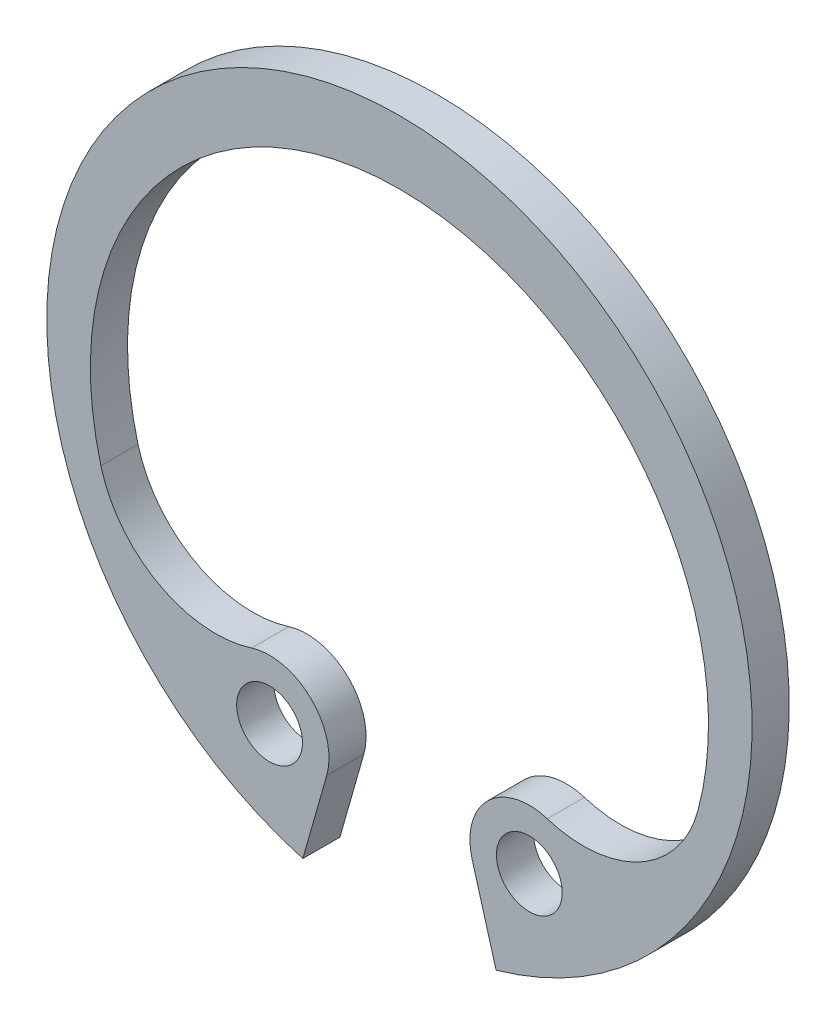
ISO-10303-21;
HEADER;
FILE_DESCRIPTION(('STEP AP214'),'2;1');
FILE_NAME('part.step','',(''),(''),'','','');
FILE_SCHEMA(('AUTOMOTIVE_DESIGN { 1 0 10303 214 1 1 1 1 }'));
ENDSEC;
DATA;
#1=APPLICATION_CONTEXT('core data for automotive mechanical design processes');
#2=APPLICATION_PROTOCOL_DEFINITION('international standard','automotive_design',2000,#1);
#3=PRODUCT_CONTEXT('',#1,'mechanical');
#4=PRODUCT('Part','Part','',(#3));
#5=PRODUCT_RELATED_PRODUCT_CATEGORY('part','',(#4));
#6=PRODUCT_DEFINITION_FORMATION('','',#4);
#7=PRODUCT_DEFINITION_CONTEXT('part definition',#1,'design');
#8=PRODUCT_DEFINITION('design','',#6,#7);
#9=PRODUCT_DEFINITION_SHAPE('','',#8);
#10=(LENGTH_UNIT() NAMED_UNIT(*) SI_UNIT(.MILLI.,.METRE.));
#11=(NAMED_UNIT(*) PLANE_ANGLE_UNIT() SI_UNIT($,.RADIAN.));
#12=(NAMED_UNIT(*) SI_UNIT($,.STERADIAN.) SOLID_ANGLE_UNIT());
#13=UNCERTAINTY_MEASURE_WITH_UNIT(LENGTH_MEASURE(1.E-05),#10,'distance_accuracy_value','');
#14=(GEOMETRIC_REPRESENTATION_CONTEXT(3) GLOBAL_UNCERTAINTY_ASSIGNED_CONTEXT((#13)) GLOBAL_UNIT_ASSIGNED_CONTEXT((#10,
#11,#12)) REPRESENTATION_CONTEXT('',''));
#15=CARTESIAN_POINT('',(0.,0.,0.));
#16=DIRECTION('',(0.,0.,1.));
#17=DIRECTION('',(1.,0.,0.));
#18=AXIS2_PLACEMENT_3D('',#15,#16,#17);
#19=CARTESIAN_POINT('',(0.,0.0138498754233171,-0.8705977));
#20=DIRECTION('',(0.,0.,1.));
#21=DIRECTION('',(1.,0.,0.));
#22=AXIS2_PLACEMENT_3D('',#19,#20,#21);
#23=CYLINDRICAL_SURFACE('',#22,8.0958563);
#24=CARTESIAN_POINT('',(0.,0.0138498754233171,-0.0184023));
#25=DIRECTION('',(0.,0.,1.));
#26=DIRECTION('',(1.,0.,0.));
#27=AXIS2_PLACEMENT_3D('',#24,#25,#26);
#28=CIRCLE('',#27,8.0958563);
#29=CARTESIAN_POINT('',(2.21824099138706,-7.77218224205345,-0.0184023));
#30=VERTEX_POINT('',#29);
#31=CARTESIAN_POINT('',(-2.21824099138707,-7.77218224205346,-0.0184023));
#32=VERTEX_POINT('',#31);
#33=EDGE_CURVE('E129',#30,#32,#28,.T.);
#34=ORIENTED_EDGE('',*,*,#33,.F.);
#35=DIRECTION('',(0.,0.,1.));
#36=VECTOR('',#35,1.);
#37=CARTESIAN_POINT('',(2.21824099138706,-7.77218224205345,-0.8705977));
#38=LINE('',#37,#36);
#39=CARTESIAN_POINT('',(2.21824099138706,-7.77218224205345,-0.8705977));
#40=VERTEX_POINT('',#39);
#41=EDGE_CURVE('E11',#40,#30,#38,.T.);
#42=ORIENTED_EDGE('',*,*,#41,.F.);
#43=CARTESIAN_POINT('',(0.,0.0138498754233171,-0.8705977));
#44=DIRECTION('',(0.,0.,1.));
#45=DIRECTION('',(1.,0.,0.));
#46=AXIS2_PLACEMENT_3D('',#43,#44,#45);
#47=CIRCLE('',#46,8.0958563);
#48=CARTESIAN_POINT('',(-2.21824099138707,-7.77218224205346,-0.8705977));
#49=VERTEX_POINT('',#48);
#50=EDGE_CURVE('E150',#40,#49,#47,.T.);
#51=ORIENTED_EDGE('',*,*,#50,.T.);
#52=DIRECTION('',(0.,0.,1.));
#53=VECTOR('',#52,1.);
#54=CARTESIAN_POINT('',(-2.21824099138707,-7.77218224205346,-0.8705977));
#55=LINE('',#54,#53);
#56=EDGE_CURVE('E35',#49,#32,#55,.T.);
#57=ORIENTED_EDGE('',*,*,#56,.T.);
#58=EDGE_LOOP('',(#34,#42,#51,#57));
#59=FACE_BOUND('',#58,.T.);
#60=ADVANCED_FACE('F32',(#59),#23,.T.);
#61=CARTESIAN_POINT('',(1.66993388104392,-5.84762274290578,-0.8705977));
#62=DIRECTION('',(-0.96173052348728,-0.273997080628394,0.));
#63=DIRECTION('',(0.273997080628394,-0.96173052348728,0.));
#64=AXIS2_PLACEMENT_3D('',#61,#62,#63);
#65=PLANE('',#64);
#66=DIRECTION('',(0.273997080628394,-0.96173052348728,0.));
#67=VECTOR('',#66,1.);
#68=CARTESIAN_POINT('',(1.66993388104392,-5.84762274290578,-0.0184023));
#69=LINE('',#68,#67);
#70=CARTESIAN_POINT('',(1.66993388104392,-5.84762274290578,-0.0184023));
#71=VERTEX_POINT('',#70);
#72=EDGE_CURVE('E148',#71,#30,#69,.T.);
#73=ORIENTED_EDGE('',*,*,#72,.F.);
#74=DIRECTION('',(0.,0.,1.));
#75=VECTOR('',#74,1.);
#76=CARTESIAN_POINT('',(1.66993388104392,-5.84762274290578,-0.8705977));
#77=LINE('',#76,#75);
#78=CARTESIAN_POINT('',(1.66993388104392,-5.84762274290578,-0.8705977));
#79=VERTEX_POINT('',#78);
#80=EDGE_CURVE('E41',#79,#71,#77,.T.);
#81=ORIENTED_EDGE('',*,*,#80,.F.);
#82=DIRECTION('',(0.273997080628394,-0.96173052348728,0.));
#83=VECTOR('',#82,1.);
#84=CARTESIAN_POINT('',(1.66993388104392,-5.84762274290578,-0.8705977));
#85=LINE('',#84,#83);
#86=EDGE_CURVE('E119',#79,#40,#85,.T.);
#87=ORIENTED_EDGE('',*,*,#86,.T.);
#88=ORIENTED_EDGE('',*,*,#41,.T.);
#89=EDGE_LOOP('',(#73,#81,#87,#88));
#90=FACE_BOUND('',#89,.T.);
#91=ADVANCED_FACE('F162',(#90),#65,.T.);
#92=CARTESIAN_POINT('',(2.98126560609263,-5.47402426014586,-0.8705977));
#93=DIRECTION('',(0.,0.,1.));
#94=DIRECTION('',(1.,0.,0.));
#95=AXIS2_PLACEMENT_3D('',#92,#93,#94);
#96=CYLINDRICAL_SURFACE('',#95,1.36351263999999);
#97=CARTESIAN_POINT('',(2.98126560609263,-5.47402426014586,-0.0184023));
#98=DIRECTION('',(0.,0.,1.));
#99=DIRECTION('',(1.,0.,0.));
#100=AXIS2_PLACEMENT_3D('',#97,#98,#99);
#101=CIRCLE('',#100,1.36351263999999);
#102=CARTESIAN_POINT('',(3.39387782003509,-4.17444052665839,-0.0184023));
#103=VERTEX_POINT('',#102);
#104=EDGE_CURVE('E106',#103,#71,#101,.T.);
#105=ORIENTED_EDGE('',*,*,#104,.F.);
#106=DIRECTION('',(0.,0.,1.));
#107=VECTOR('',#106,1.);
#108=CARTESIAN_POINT('',(3.39387782003509,-4.17444052665839,-0.8705977));
#109=LINE('',#108,#107);
#110=CARTESIAN_POINT('',(3.39387782003509,-4.17444052665839,-0.8705977));
#111=VERTEX_POINT('',#110);
#112=EDGE_CURVE('E101',#111,#103,#109,.T.);
#113=ORIENTED_EDGE('',*,*,#112,.F.);
#114=CARTESIAN_POINT('',(2.98126560609263,-5.47402426014586,-0.8705977));
#115=DIRECTION('',(0.,0.,1.));
#116=DIRECTION('',(1.,0.,0.));
#117=AXIS2_PLACEMENT_3D('',#114,#115,#116);
#118=CIRCLE('',#117,1.36351263999999);
#119=EDGE_CURVE('E104',#111,#79,#118,.T.);
#120=ORIENTED_EDGE('',*,*,#119,.T.);
#121=ORIENTED_EDGE('',*,*,#80,.T.);
#122=EDGE_LOOP('',(#105,#113,#120,#121));
#123=FACE_BOUND('',#122,.T.);
#124=ADVANCED_FACE('F103',(#123),#96,.T.);
#125=CARTESIAN_POINT('',(4.21910224792002,-1.57527305968342,-0.8705977));
#126=DIRECTION('',(0.,0.,1.));
#127=DIRECTION('',(1.,0.,0.));
#128=AXIS2_PLACEMENT_3D('',#125,#126,#127);
#129=CYLINDRICAL_SURFACE('',#128,2.72702528000001);
#130=CARTESIAN_POINT('',(4.21910224792002,-1.57527305968342,-0.0184023));
#131=DIRECTION('',(0.,0.,-1.));
#132=DIRECTION('',(-1.,0.,0.));
#133=AXIS2_PLACEMENT_3D('',#130,#131,#132);
#134=CIRCLE('',#133,2.72702528000001);
#135=CARTESIAN_POINT('',(6.85337913023439,-2.28043416543389,-0.0184023));
#136=VERTEX_POINT('',#135);
#137=EDGE_CURVE('E145',#136,#103,#134,.T.);
#138=ORIENTED_EDGE('',*,*,#137,.F.);
#139=DIRECTION('',(0.,0.,1.));
#140=VECTOR('',#139,1.);
#141=CARTESIAN_POINT('',(6.85337913023439,-2.28043416543389,-0.8705977));
#142=LINE('',#141,#140);
#143=CARTESIAN_POINT('',(6.85337913023439,-2.28043416543389,-0.8705977));
#144=VERTEX_POINT('',#143);
#145=EDGE_CURVE('E111',#144,#136,#142,.T.);
#146=ORIENTED_EDGE('',*,*,#145,.F.);
#147=CARTESIAN_POINT('',(4.21910224792002,-1.57527305968342,-0.8705977));
#148=DIRECTION('',(0.,0.,-1.));
#149=DIRECTION('',(-1.,0.,0.));
#150=AXIS2_PLACEMENT_3D('',#147,#148,#149);
#151=CIRCLE('',#150,2.72702528000001);
#152=EDGE_CURVE('E117',#144,#111,#151,.T.);
#153=ORIENTED_EDGE('',*,*,#152,.T.);
#154=ORIENTED_EDGE('',*,*,#112,.T.);
#155=EDGE_LOOP('',(#138,#146,#153,#154));
#156=FACE_BOUND('',#155,.T.);
#157=ADVANCED_FACE('F121',(#156),#129,.F.);
#158=CARTESIAN_POINT('',(0.,-0.445875149239109,-0.8705977));
#159=DIRECTION('',(0.,0.,1.));
#160=DIRECTION('',(1.,0.,0.));
#161=AXIS2_PLACEMENT_3D('',#158,#159,#160);
#162=CYLINDRICAL_SURFACE('',#161,7.09467492466243);
#163=CARTESIAN_POINT('',(0.,-0.445875149239109,-0.0184023));
#164=DIRECTION('',(0.,0.,-1.));
#165=DIRECTION('',(-1.,0.,0.));
#166=AXIS2_PLACEMENT_3D('',#163,#164,#165);
#167=CIRCLE('',#166,7.09467492466243);
#168=CARTESIAN_POINT('',(-6.85337913023439,-2.28043416543389,-0.0184023));
#169=VERTEX_POINT('',#168);
#170=EDGE_CURVE('E142',#169,#136,#167,.T.);
#171=ORIENTED_EDGE('',*,*,#170,.F.);
#172=DIRECTION('',(0.,0.,1.));
#173=VECTOR('',#172,1.);
#174=CARTESIAN_POINT('',(-6.85337913023439,-2.28043416543389,-0.8705977));
#175=LINE('',#174,#173);
#176=CARTESIAN_POINT('',(-6.85337913023439,-2.28043416543389,-0.8705977));
#177=VERTEX_POINT('',#176);
#178=EDGE_CURVE('E154',#177,#169,#175,.T.);
#179=ORIENTED_EDGE('',*,*,#178,.F.);
#180=CARTESIAN_POINT('',(0.,-0.445875149239109,-0.8705977));
#181=DIRECTION('',(0.,0.,-1.));
#182=DIRECTION('',(-1.,0.,0.));
#183=AXIS2_PLACEMENT_3D('',#180,#181,#182);
#184=CIRCLE('',#183,7.09467492466243);
#185=EDGE_CURVE('E122',#177,#144,#184,.T.);
#186=ORIENTED_EDGE('',*,*,#185,.T.);
#187=ORIENTED_EDGE('',*,*,#145,.T.);
#188=EDGE_LOOP('',(#171,#179,#186,#187));
#189=FACE_BOUND('',#188,.T.);
#190=ADVANCED_FACE('F175',(#189),#162,.F.);
#191=CARTESIAN_POINT('',(-4.21910224792004,-1.57527305968342,-0.8705977));
#192=DIRECTION('',(0.,0.,1.));
#193=DIRECTION('',(1.,0.,0.));
#194=AXIS2_PLACEMENT_3D('',#191,#192,#193);
#195=CYLINDRICAL_SURFACE('',#194,2.72702528);
#196=CARTESIAN_POINT('',(-4.21910224792004,-1.57527305968342,-0.0184023));
#197=DIRECTION('',(0.,0.,-1.));
#198=DIRECTION('',(-1.,0.,0.));
#199=AXIS2_PLACEMENT_3D('',#196,#197,#198);
#200=CIRCLE('',#199,2.72702528);
#201=CARTESIAN_POINT('',(-3.3938778200351,-4.17444052665838,-0.0184023));
#202=VERTEX_POINT('',#201);
#203=EDGE_CURVE('E139',#202,#169,#200,.T.);
#204=ORIENTED_EDGE('',*,*,#203,.F.);
#205=DIRECTION('',(0.,0.,1.));
#206=VECTOR('',#205,1.);
#207=CARTESIAN_POINT('',(-3.3938778200351,-4.17444052665838,-0.8705977));
#208=LINE('',#207,#206);
#209=CARTESIAN_POINT('',(-3.3938778200351,-4.17444052665838,-0.8705977));
#210=VERTEX_POINT('',#209);
#211=EDGE_CURVE('E156',#210,#202,#208,.T.);
#212=ORIENTED_EDGE('',*,*,#211,.F.);
#213=CARTESIAN_POINT('',(-4.21910224792004,-1.57527305968342,-0.8705977));
#214=DIRECTION('',(0.,0.,-1.));
#215=DIRECTION('',(-1.,0.,0.));
#216=AXIS2_PLACEMENT_3D('',#213,#214,#215);
#217=CIRCLE('',#216,2.72702528);
#218=EDGE_CURVE('E124',#210,#177,#217,.T.);
#219=ORIENTED_EDGE('',*,*,#218,.T.);
#220=ORIENTED_EDGE('',*,*,#178,.T.);
#221=EDGE_LOOP('',(#204,#212,#219,#220));
#222=FACE_BOUND('',#221,.T.);
#223=ADVANCED_FACE('F178',(#222),#195,.F.);
#224=CARTESIAN_POINT('',(-2.98126560609263,-5.47402426014586,-0.8705977));
#225=DIRECTION('',(0.,0.,1.));
#226=DIRECTION('',(1.,0.,0.));
#227=AXIS2_PLACEMENT_3D('',#224,#225,#226);
#228=CYLINDRICAL_SURFACE('',#227,1.36351264);
#229=CARTESIAN_POINT('',(-2.98126560609263,-5.47402426014586,-0.0184023));
#230=DIRECTION('',(0.,0.,1.));
#231=DIRECTION('',(1.,0.,0.));
#232=AXIS2_PLACEMENT_3D('',#229,#230,#231);
#233=CIRCLE('',#232,1.36351264);
#234=CARTESIAN_POINT('',(-1.66993388104391,-5.84762274290579,-0.0184023));
#235=VERTEX_POINT('',#234);
#236=EDGE_CURVE('E136',#235,#202,#233,.T.);
#237=ORIENTED_EDGE('',*,*,#236,.F.);
#238=DIRECTION('',(0.,0.,1.));
#239=VECTOR('',#238,1.);
#240=CARTESIAN_POINT('',(-1.66993388104391,-5.84762274290579,-0.8705977));
#241=LINE('',#240,#239);
#242=CARTESIAN_POINT('',(-1.66993388104391,-5.84762274290579,-0.8705977));
#243=VERTEX_POINT('',#242);
#244=EDGE_CURVE('E157',#243,#235,#241,.T.);
#245=ORIENTED_EDGE('',*,*,#244,.F.);
#246=CARTESIAN_POINT('',(-2.98126560609263,-5.47402426014586,-0.8705977));
#247=DIRECTION('',(0.,0.,1.));
#248=DIRECTION('',(1.,0.,0.));
#249=AXIS2_PLACEMENT_3D('',#246,#247,#248);
#250=CIRCLE('',#249,1.36351264);
#251=EDGE_CURVE('E224',#243,#210,#250,.T.);
#252=ORIENTED_EDGE('',*,*,#251,.T.);
#253=ORIENTED_EDGE('',*,*,#211,.T.);
#254=EDGE_LOOP('',(#237,#245,#252,#253));
#255=FACE_BOUND('',#254,.T.);
#256=ADVANCED_FACE('F182',(#255),#228,.T.);
#257=CARTESIAN_POINT('',(-2.21824099138707,-7.77218224205346,-0.8705977));
#258=DIRECTION('',(0.961730523487278,-0.273997080628401,0.));
#259=DIRECTION('',(0.273997080628401,0.961730523487278,0.));
#260=AXIS2_PLACEMENT_3D('',#257,#258,#259);
#261=PLANE('',#260);
#262=DIRECTION('',(0.273997080628401,0.961730523487278,0.));
#263=VECTOR('',#262,1.);
#264=CARTESIAN_POINT('',(-2.21824099138707,-7.77218224205346,-0.0184023));
#265=LINE('',#264,#263);
#266=EDGE_CURVE('E132',#32,#235,#265,.T.);
#267=ORIENTED_EDGE('',*,*,#266,.F.);
#268=ORIENTED_EDGE('',*,*,#56,.F.);
#269=DIRECTION('',(0.273997080628401,0.961730523487278,0.));
#270=VECTOR('',#269,1.);
#271=CARTESIAN_POINT('',(-2.21824099138707,-7.77218224205346,-0.8705977));
#272=LINE('',#271,#270);
#273=EDGE_CURVE('E222',#49,#243,#272,.T.);
#274=ORIENTED_EDGE('',*,*,#273,.T.);
#275=ORIENTED_EDGE('',*,*,#244,.T.);
#276=EDGE_LOOP('',(#267,#268,#274,#275));
#277=FACE_BOUND('',#276,.T.);
#278=ADVANCED_FACE('F159',(#277),#261,.T.);
#279=CARTESIAN_POINT('',(0.,0.0138498754233171,-0.8705977));
#280=DIRECTION('',(0.,0.,1.));
#281=DIRECTION('',(1.,0.,0.));
#282=AXIS2_PLACEMENT_3D('',#279,#280,#281);
#283=PLANE('',#282);
#284=CARTESIAN_POINT('',(-2.98126560609263,-5.47402426014586,-0.8705977));
#285=DIRECTION('',(0.,0.,1.));
#286=DIRECTION('',(-1.,0.,0.));
#287=AXIS2_PLACEMENT_3D('',#284,#285,#286);
#288=CIRCLE('',#287,0.75480164);
#289=CARTESIAN_POINT('',(-2.22646396609263,-5.47402426014586,-0.8705977));
#290=VERTEX_POINT('',#289);
#291=EDGE_CURVE('E209',#290,#290,#288,.T.);
#292=ORIENTED_EDGE('',*,*,#291,.T.);
#293=EDGE_LOOP('',(#292));
#294=FACE_BOUND('',#293,.T.);
#295=CARTESIAN_POINT('',(2.98126560609263,-5.47402426014586,-0.8705977));
#296=DIRECTION('',(0.,0.,1.));
#297=DIRECTION('',(-1.,0.,0.));
#298=AXIS2_PLACEMENT_3D('',#295,#296,#297);
#299=CIRCLE('',#298,0.75480164);
#300=CARTESIAN_POINT('',(3.73606724609263,-5.47402426014586,-0.8705977));
#301=VERTEX_POINT('',#300);
#302=EDGE_CURVE('E133',#301,#301,#299,.T.);
#303=ORIENTED_EDGE('',*,*,#302,.T.);
#304=EDGE_LOOP('',(#303));
#305=FACE_BOUND('',#304,.T.);
#306=ORIENTED_EDGE('',*,*,#50,.F.);
#307=ORIENTED_EDGE('',*,*,#86,.F.);
#308=ORIENTED_EDGE('',*,*,#119,.F.);
#309=ORIENTED_EDGE('',*,*,#152,.F.);
#310=ORIENTED_EDGE('',*,*,#185,.F.);
#311=ORIENTED_EDGE('',*,*,#218,.F.);
#312=ORIENTED_EDGE('',*,*,#251,.F.);
#313=ORIENTED_EDGE('',*,*,#273,.F.);
#314=EDGE_LOOP('',(#306,#307,#308,#309,#310,#311,#312,#313));
#315=FACE_BOUND('',#314,.T.);
#316=ADVANCED_FACE('F115',(#294,#305,#315),#283,.F.);
#317=CARTESIAN_POINT('',(0.,0.0138498754233171,-0.0184023));
#318=DIRECTION('',(0.,0.,1.));
#319=DIRECTION('',(1.,0.,0.));
#320=AXIS2_PLACEMENT_3D('',#317,#318,#319);
#321=PLANE('',#320);
#322=CARTESIAN_POINT('',(-2.98126560609263,-5.47402426014586,-0.0184023));
#323=DIRECTION('',(0.,0.,1.));
#324=DIRECTION('',(-1.,0.,0.));
#325=AXIS2_PLACEMENT_3D('',#322,#323,#324);
#326=CIRCLE('',#325,0.75480164);
#327=CARTESIAN_POINT('',(-2.22646396609263,-5.47402426014586,-0.0184022999999999));
#328=VERTEX_POINT('',#327);
#329=EDGE_CURVE('E212',#328,#328,#326,.T.);
#330=ORIENTED_EDGE('',*,*,#329,.F.);
#331=EDGE_LOOP('',(#330));
#332=FACE_BOUND('',#331,.T.);
#333=CARTESIAN_POINT('',(2.98126560609263,-5.47402426014586,-0.0184023));
#334=DIRECTION('',(0.,0.,1.));
#335=DIRECTION('',(-1.,0.,0.));
#336=AXIS2_PLACEMENT_3D('',#333,#334,#335);
#337=CIRCLE('',#336,0.75480164);
#338=CARTESIAN_POINT('',(3.73606724609263,-5.47402426014586,-0.0184022999999999));
#339=VERTEX_POINT('',#338);
#340=EDGE_CURVE('E214',#339,#339,#337,.T.);
#341=ORIENTED_EDGE('',*,*,#340,.F.);
#342=EDGE_LOOP('',(#341));
#343=FACE_BOUND('',#342,.T.);
#344=ORIENTED_EDGE('',*,*,#33,.T.);
#345=ORIENTED_EDGE('',*,*,#266,.T.);
#346=ORIENTED_EDGE('',*,*,#236,.T.);
#347=ORIENTED_EDGE('',*,*,#203,.T.);
#348=ORIENTED_EDGE('',*,*,#170,.T.);
#349=ORIENTED_EDGE('',*,*,#137,.T.);
#350=ORIENTED_EDGE('',*,*,#104,.T.);
#351=ORIENTED_EDGE('',*,*,#72,.T.);
#352=EDGE_LOOP('',(#344,#345,#346,#347,#348,#349,#350,#351));
#353=FACE_BOUND('',#352,.T.);
#354=ADVANCED_FACE('F161',(#332,#343,#353),#321,.T.);
#355=CARTESIAN_POINT('',(2.98126560609263,-5.47402426014586,-0.8705977));
#356=DIRECTION('',(0.,0.,1.));
#357=DIRECTION('',(1.,0.,0.));
#358=AXIS2_PLACEMENT_3D('',#355,#356,#357);
#359=CYLINDRICAL_SURFACE('',#358,0.75480164);
#360=CARTESIAN_POINT('',(3.73606724609263,-5.47402426014586,-0.8705977));
#361=CARTESIAN_POINT('',(3.73606724609263,-5.47402426014586,-0.861720664583333));
#362=CARTESIAN_POINT('',(3.73606724609263,-5.47402426014586,-0.852843629166667));
#363=CARTESIAN_POINT('',(3.73606724609263,-5.47402426014586,-0.835089558333333));
#364=CARTESIAN_POINT('',(3.73606724609263,-5.47402426014586,-0.826212522916667));
#365=CARTESIAN_POINT('',(3.73606724609263,-5.47402426014586,-0.808458452083333));
#366=CARTESIAN_POINT('',(3.73606724609263,-5.47402426014586,-0.799581416666667));
#367=CARTESIAN_POINT('',(3.73606724609263,-5.47402426014586,-0.781827345833333));
#368=CARTESIAN_POINT('',(3.73606724609263,-5.47402426014586,-0.772950310416667));
#369=CARTESIAN_POINT('',(3.73606724609263,-5.47402426014586,-0.755196239583333));
#370=CARTESIAN_POINT('',(3.73606724609263,-5.47402426014586,-0.746319204166667));
#371=CARTESIAN_POINT('',(3.73606724609263,-5.47402426014586,-0.728565133333333));
#372=CARTESIAN_POINT('',(3.73606724609263,-5.47402426014586,-0.719688097916667));
#373=CARTESIAN_POINT('',(3.73606724609263,-5.47402426014586,-0.701934027083333));
#374=CARTESIAN_POINT('',(3.73606724609263,-5.47402426014586,-0.693056991666667));
#375=CARTESIAN_POINT('',(3.73606724609263,-5.47402426014586,-0.675302920833333));
#376=CARTESIAN_POINT('',(3.73606724609263,-5.47402426014586,-0.666425885416667));
#377=CARTESIAN_POINT('',(3.73606724609263,-5.47402426014586,-0.648671814583333));
#378=CARTESIAN_POINT('',(3.73606724609263,-5.47402426014586,-0.639794779166667));
#379=CARTESIAN_POINT('',(3.73606724609263,-5.47402426014586,-0.622040708333333));
#380=CARTESIAN_POINT('',(3.73606724609263,-5.47402426014586,-0.613163672916667));
#381=CARTESIAN_POINT('',(3.73606724609263,-5.47402426014586,-0.595409602083333));
#382=CARTESIAN_POINT('',(3.73606724609263,-5.47402426014586,-0.586532566666667));
#383=CARTESIAN_POINT('',(3.73606724609263,-5.47402426014586,-0.568778495833333));
#384=CARTESIAN_POINT('',(3.73606724609263,-5.47402426014586,-0.559901460416667));
#385=CARTESIAN_POINT('',(3.73606724609263,-5.47402426014586,-0.542147389583333));
#386=CARTESIAN_POINT('',(3.73606724609263,-5.47402426014586,-0.533270354166667));
#387=CARTESIAN_POINT('',(3.73606724609263,-5.47402426014586,-0.515516283333333));
#388=CARTESIAN_POINT('',(3.73606724609263,-5.47402426014586,-0.506639247916667));
#389=CARTESIAN_POINT('',(3.73606724609263,-5.47402426014586,-0.488885177083333));
#390=CARTESIAN_POINT('',(3.73606724609263,-5.47402426014586,-0.480008141666667));
#391=CARTESIAN_POINT('',(3.73606724609263,-5.47402426014586,-0.462254070833333));
#392=CARTESIAN_POINT('',(3.73606724609263,-5.47402426014586,-0.453377035416667));
#393=CARTESIAN_POINT('',(3.73606724609263,-5.47402426014586,-0.435622964583333));
#394=CARTESIAN_POINT('',(3.73606724609263,-5.47402426014586,-0.426745929166667));
#395=CARTESIAN_POINT('',(3.73606724609263,-5.47402426014586,-0.408991858333333));
#396=CARTESIAN_POINT('',(3.73606724609263,-5.47402426014586,-0.400114822916667));
#397=CARTESIAN_POINT('',(3.73606724609263,-5.47402426014586,-0.382360752083333));
#398=CARTESIAN_POINT('',(3.73606724609263,-5.47402426014586,-0.373483716666667));
#399=CARTESIAN_POINT('',(3.73606724609263,-5.47402426014586,-0.355729645833333));
#400=CARTESIAN_POINT('',(3.73606724609263,-5.47402426014586,-0.346852610416667));
#401=CARTESIAN_POINT('',(3.73606724609263,-5.47402426014586,-0.329098539583333));
#402=CARTESIAN_POINT('',(3.73606724609263,-5.47402426014586,-0.320221504166667));
#403=CARTESIAN_POINT('',(3.73606724609263,-5.47402426014586,-0.302467433333333));
#404=CARTESIAN_POINT('',(3.73606724609263,-5.47402426014586,-0.293590397916667));
#405=CARTESIAN_POINT('',(3.73606724609263,-5.47402426014586,-0.275836327083333));
#406=CARTESIAN_POINT('',(3.73606724609263,-5.47402426014586,-0.266959291666667));
#407=CARTESIAN_POINT('',(3.73606724609263,-5.47402426014586,-0.249205220833333));
#408=CARTESIAN_POINT('',(3.73606724609263,-5.47402426014586,-0.240328185416667));
#409=CARTESIAN_POINT('',(3.73606724609263,-5.47402426014586,-0.222574114583333));
#410=CARTESIAN_POINT('',(3.73606724609263,-5.47402426014586,-0.213697079166667));
#411=CARTESIAN_POINT('',(3.73606724609263,-5.47402426014586,-0.195943008333333));
#412=CARTESIAN_POINT('',(3.73606724609263,-5.47402426014586,-0.187065972916667));
#413=CARTESIAN_POINT('',(3.73606724609263,-5.47402426014586,-0.169311902083333));
#414=CARTESIAN_POINT('',(3.73606724609263,-5.47402426014586,-0.160434866666667));
#415=CARTESIAN_POINT('',(3.73606724609263,-5.47402426014586,-0.142680795833333));
#416=CARTESIAN_POINT('',(3.73606724609263,-5.47402426014586,-0.133803760416667));
#417=CARTESIAN_POINT('',(3.73606724609263,-5.47402426014586,-0.116049689583333));
#418=CARTESIAN_POINT('',(3.73606724609263,-5.47402426014586,-0.107172654166667));
#419=CARTESIAN_POINT('',(3.73606724609263,-5.47402426014586,-0.0894185833333333));
#420=CARTESIAN_POINT('',(3.73606724609263,-5.47402426014586,-0.0805415479166666));
#421=CARTESIAN_POINT('',(3.73606724609263,-5.47402426014586,-0.0627874770833333));
#422=CARTESIAN_POINT('',(3.73606724609263,-5.47402426014586,-0.0539104416666666));
#423=CARTESIAN_POINT('',(3.73606724609263,-5.47402426014586,-0.0361563708333333));
#424=CARTESIAN_POINT('',(3.73606724609263,-5.47402426014586,-0.0272793354166666));
#425=CARTESIAN_POINT('',(3.73606724609263,-5.47402426014586,-0.0184022999999999));
#426=B_SPLINE_CURVE_WITH_KNOTS('',3,(#360,#361,#362,#363,#364,#365,#366,#367,#368,#369,#370,
#371,#372,#373,#374,#375,#376,#377,#378,#379,#380,#381,#382,#383,#384,#385,#386,#387,#388,#389,
#390,#391,#392,#393,#394,#395,#396,#397,#398,#399,#400,#401,#402,#403,#404,#405,#406,#407,#408,
#409,#410,#411,#412,#413,#414,#415,#416,#417,#418,#419,#420,#421,#422,#423,#424,#425),
.UNSPECIFIED.,.F.,.F.,(4,2,2,2,2,2,2,2,2,2,2,2,2,2,2,2,2,2,2,2,2,2,2,2,2,2,2,2,2,2,2,2,4),(0.,
0.0266311062500001,0.0532622125000001,0.0798933187500001,0.106524425,0.13315553125,0.1597866375,
0.18641774375,0.21304885,0.23967995625,0.2663110625,0.29294216875,0.319573275,0.34620438125,
0.3728354875,0.39946659375,0.4260977,0.45272880625,0.4793599125,0.50599101875,0.532622125,
0.55925323125,0.5858843375,0.61251544375,0.63914655,0.66577765625,0.6924087625,0.71903986875,
0.745670975,0.77230208125,0.7989331875,0.82556429375,0.8521954),.UNSPECIFIED.);
#427=EDGE_CURVE('BSEAM194',#301,#339,#426,.T.);
#428=ORIENTED_EDGE('',*,*,#302,.F.);
#429=ORIENTED_EDGE('',*,*,#340,.T.);
#430=ORIENTED_EDGE('',*,*,#427,.T.);
#431=ORIENTED_EDGE('',*,*,#427,.F.);
#432=EDGE_LOOP('',(#428,#430,#429,#431));
#433=FACE_BOUND('',#432,.T.);
#434=ADVANCED_FACE('F194',(#433),#359,.F.);
#435=CARTESIAN_POINT('',(-2.98126560609263,-5.47402426014586,-0.8705977));
#436=DIRECTION('',(0.,0.,1.));
#437=DIRECTION('',(1.,0.,0.));
#438=AXIS2_PLACEMENT_3D('',#435,#436,#437);
#439=CYLINDRICAL_SURFACE('',#438,0.75480164);
#440=CARTESIAN_POINT('',(-2.22646396609263,-5.47402426014586,-0.8705977));
#441=CARTESIAN_POINT('',(-2.22646396609263,-5.47402426014586,-0.861720664583333));
#442=CARTESIAN_POINT('',(-2.22646396609263,-5.47402426014586,-0.852843629166667));
#443=CARTESIAN_POINT('',(-2.22646396609263,-5.47402426014586,-0.835089558333333));
#444=CARTESIAN_POINT('',(-2.22646396609263,-5.47402426014586,-0.826212522916667));
#445=CARTESIAN_POINT('',(-2.22646396609263,-5.47402426014586,-0.808458452083333));
#446=CARTESIAN_POINT('',(-2.22646396609263,-5.47402426014586,-0.799581416666667));
#447=CARTESIAN_POINT('',(-2.22646396609263,-5.47402426014586,-0.781827345833333));
#448=CARTESIAN_POINT('',(-2.22646396609263,-5.47402426014586,-0.772950310416667));
#449=CARTESIAN_POINT('',(-2.22646396609263,-5.47402426014586,-0.755196239583333));
#450=CARTESIAN_POINT('',(-2.22646396609263,-5.47402426014586,-0.746319204166667));
#451=CARTESIAN_POINT('',(-2.22646396609263,-5.47402426014586,-0.728565133333333));
#452=CARTESIAN_POINT('',(-2.22646396609263,-5.47402426014586,-0.719688097916667));
#453=CARTESIAN_POINT('',(-2.22646396609263,-5.47402426014586,-0.701934027083333));
#454=CARTESIAN_POINT('',(-2.22646396609263,-5.47402426014586,-0.693056991666667));
#455=CARTESIAN_POINT('',(-2.22646396609263,-5.47402426014586,-0.675302920833333));
#456=CARTESIAN_POINT('',(-2.22646396609263,-5.47402426014586,-0.666425885416667));
#457=CARTESIAN_POINT('',(-2.22646396609263,-5.47402426014586,-0.648671814583333));
#458=CARTESIAN_POINT('',(-2.22646396609263,-5.47402426014586,-0.639794779166667));
#459=CARTESIAN_POINT('',(-2.22646396609263,-5.47402426014586,-0.622040708333333));
#460=CARTESIAN_POINT('',(-2.22646396609263,-5.47402426014586,-0.613163672916667));
#461=CARTESIAN_POINT('',(-2.22646396609263,-5.47402426014586,-0.595409602083333));
#462=CARTESIAN_POINT('',(-2.22646396609263,-5.47402426014586,-0.586532566666667));
#463=CARTESIAN_POINT('',(-2.22646396609263,-5.47402426014586,-0.568778495833333));
#464=CARTESIAN_POINT('',(-2.22646396609263,-5.47402426014586,-0.559901460416667));
#465=CARTESIAN_POINT('',(-2.22646396609263,-5.47402426014586,-0.542147389583333));
#466=CARTESIAN_POINT('',(-2.22646396609263,-5.47402426014586,-0.533270354166667));
#467=CARTESIAN_POINT('',(-2.22646396609263,-5.47402426014586,-0.515516283333333));
#468=CARTESIAN_POINT('',(-2.22646396609263,-5.47402426014586,-0.506639247916667));
#469=CARTESIAN_POINT('',(-2.22646396609263,-5.47402426014586,-0.488885177083333));
#470=CARTESIAN_POINT('',(-2.22646396609263,-5.47402426014586,-0.480008141666667));
#471=CARTESIAN_POINT('',(-2.22646396609263,-5.47402426014586,-0.462254070833333));
#472=CARTESIAN_POINT('',(-2.22646396609263,-5.47402426014586,-0.453377035416667));
#473=CARTESIAN_POINT('',(-2.22646396609263,-5.47402426014586,-0.435622964583333));
#474=CARTESIAN_POINT('',(-2.22646396609263,-5.47402426014586,-0.426745929166667));
#475=CARTESIAN_POINT('',(-2.22646396609263,-5.47402426014586,-0.408991858333333));
#476=CARTESIAN_POINT('',(-2.22646396609263,-5.47402426014586,-0.400114822916667));
#477=CARTESIAN_POINT('',(-2.22646396609263,-5.47402426014586,-0.382360752083333));
#478=CARTESIAN_POINT('',(-2.22646396609263,-5.47402426014586,-0.373483716666667));
#479=CARTESIAN_POINT('',(-2.22646396609263,-5.47402426014586,-0.355729645833333));
#480=CARTESIAN_POINT('',(-2.22646396609263,-5.47402426014586,-0.346852610416667));
#481=CARTESIAN_POINT('',(-2.22646396609263,-5.47402426014586,-0.329098539583333));
#482=CARTESIAN_POINT('',(-2.22646396609263,-5.47402426014586,-0.320221504166667));
#483=CARTESIAN_POINT('',(-2.22646396609263,-5.47402426014586,-0.302467433333333));
#484=CARTESIAN_POINT('',(-2.22646396609263,-5.47402426014586,-0.293590397916667));
#485=CARTESIAN_POINT('',(-2.22646396609263,-5.47402426014586,-0.275836327083333));
#486=CARTESIAN_POINT('',(-2.22646396609263,-5.47402426014586,-0.266959291666667));
#487=CARTESIAN_POINT('',(-2.22646396609263,-5.47402426014586,-0.249205220833333));
#488=CARTESIAN_POINT('',(-2.22646396609263,-5.47402426014586,-0.240328185416667));
#489=CARTESIAN_POINT('',(-2.22646396609263,-5.47402426014586,-0.222574114583333));
#490=CARTESIAN_POINT('',(-2.22646396609263,-5.47402426014586,-0.213697079166667));
#491=CARTESIAN_POINT('',(-2.22646396609263,-5.47402426014586,-0.195943008333333));
#492=CARTESIAN_POINT('',(-2.22646396609263,-5.47402426014586,-0.187065972916667));
#493=CARTESIAN_POINT('',(-2.22646396609263,-5.47402426014586,-0.169311902083333));
#494=CARTESIAN_POINT('',(-2.22646396609263,-5.47402426014586,-0.160434866666667));
#495=CARTESIAN_POINT('',(-2.22646396609263,-5.47402426014586,-0.142680795833333));
#496=CARTESIAN_POINT('',(-2.22646396609263,-5.47402426014586,-0.133803760416667));
#497=CARTESIAN_POINT('',(-2.22646396609263,-5.47402426014586,-0.116049689583333));
#498=CARTESIAN_POINT('',(-2.22646396609263,-5.47402426014586,-0.107172654166667));
#499=CARTESIAN_POINT('',(-2.22646396609263,-5.47402426014586,-0.0894185833333333));
#500=CARTESIAN_POINT('',(-2.22646396609263,-5.47402426014586,-0.0805415479166666));
#501=CARTESIAN_POINT('',(-2.22646396609263,-5.47402426014586,-0.0627874770833333));
#502=CARTESIAN_POINT('',(-2.22646396609263,-5.47402426014586,-0.0539104416666666));
#503=CARTESIAN_POINT('',(-2.22646396609263,-5.47402426014586,-0.0361563708333333));
#504=CARTESIAN_POINT('',(-2.22646396609263,-5.47402426014586,-0.0272793354166666));
#505=CARTESIAN_POINT('',(-2.22646396609263,-5.47402426014586,-0.0184022999999999));
#506=B_SPLINE_CURVE_WITH_KNOTS('',3,(#440,#441,#442,#443,#444,#445,#446,#447,#448,#449,#450,
#451,#452,#453,#454,#455,#456,#457,#458,#459,#460,#461,#462,#463,#464,#465,#466,#467,#468,#469,
#470,#471,#472,#473,#474,#475,#476,#477,#478,#479,#480,#481,#482,#483,#484,#485,#486,#487,#488,
#489,#490,#491,#492,#493,#494,#495,#496,#497,#498,#499,#500,#501,#502,#503,#504,#505),
.UNSPECIFIED.,.F.,.F.,(4,2,2,2,2,2,2,2,2,2,2,2,2,2,2,2,2,2,2,2,2,2,2,2,2,2,2,2,2,2,2,2,4),(0.,
0.0266311062500001,0.0532622125000001,0.0798933187500001,0.106524425,0.13315553125,0.1597866375,
0.18641774375,0.21304885,0.23967995625,0.2663110625,0.29294216875,0.319573275,0.34620438125,
0.3728354875,0.39946659375,0.4260977,0.45272880625,0.4793599125,0.50599101875,0.532622125,
0.55925323125,0.5858843375,0.61251544375,0.63914655,0.66577765625,0.6924087625,0.71903986875,
0.745670975,0.77230208125,0.7989331875,0.82556429375,0.8521954),.UNSPECIFIED.);
#507=EDGE_CURVE('BSEAM201',#290,#328,#506,.T.);
#508=ORIENTED_EDGE('',*,*,#291,.F.);
#509=ORIENTED_EDGE('',*,*,#329,.T.);
#510=ORIENTED_EDGE('',*,*,#507,.T.);
#511=ORIENTED_EDGE('',*,*,#507,.F.);
#512=EDGE_LOOP('',(#508,#510,#509,#511));
#513=FACE_BOUND('',#512,.T.);
#514=ADVANCED_FACE('F201',(#513),#439,.F.);
#515=CLOSED_SHELL('',(#60,#91,#124,#157,#190,#223,#256,#278,#316,#354,#434,#514));
#516=MANIFOLD_SOLID_BREP('B2',#515);
#517=ADVANCED_BREP_SHAPE_REPRESENTATION('',(#18,#516),#14);
#518=SHAPE_DEFINITION_REPRESENTATION(#9,#517);
ENDSEC;
END-ISO-10303-21;
